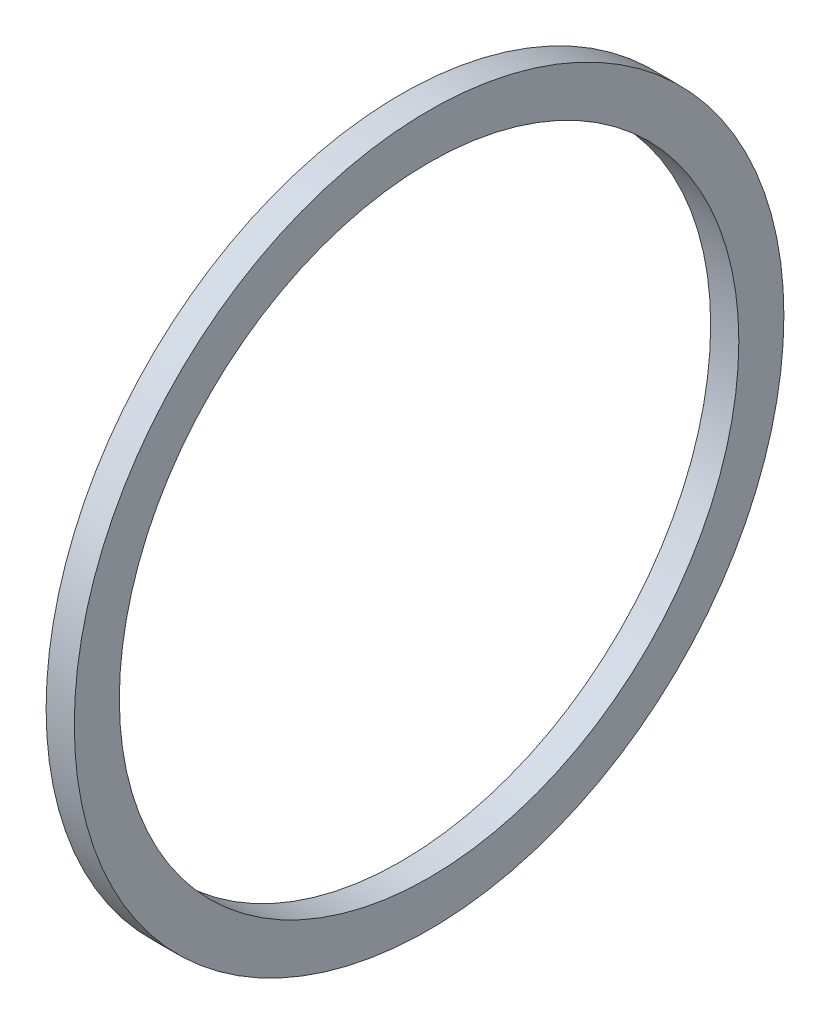
ISO-10303-21;
HEADER;
FILE_DESCRIPTION(('STEP AP214'),'2;1');
FILE_NAME('part.step','',(''),(''),'','','');
FILE_SCHEMA(('AUTOMOTIVE_DESIGN { 1 0 10303 214 1 1 1 1 }'));
ENDSEC;
DATA;
#1=APPLICATION_CONTEXT('core data for automotive mechanical design processes');
#2=APPLICATION_PROTOCOL_DEFINITION('international standard','automotive_design',2000,#1);
#3=PRODUCT_CONTEXT('',#1,'mechanical');
#4=PRODUCT('Part','Part','',(#3));
#5=PRODUCT_RELATED_PRODUCT_CATEGORY('part','',(#4));
#6=PRODUCT_DEFINITION_FORMATION('','',#4);
#7=PRODUCT_DEFINITION_CONTEXT('part definition',#1,'design');
#8=PRODUCT_DEFINITION('design','',#6,#7);
#9=PRODUCT_DEFINITION_SHAPE('','',#8);
#10=(LENGTH_UNIT() NAMED_UNIT(*) SI_UNIT(.MILLI.,.METRE.));
#11=(NAMED_UNIT(*) PLANE_ANGLE_UNIT() SI_UNIT($,.RADIAN.));
#12=(NAMED_UNIT(*) SI_UNIT($,.STERADIAN.) SOLID_ANGLE_UNIT());
#13=UNCERTAINTY_MEASURE_WITH_UNIT(LENGTH_MEASURE(1.E-05),#10,'distance_accuracy_value','');
#14=(GEOMETRIC_REPRESENTATION_CONTEXT(3) GLOBAL_UNCERTAINTY_ASSIGNED_CONTEXT((#13)) GLOBAL_UNIT_ASSIGNED_CONTEXT((#10,
#11,#12)) REPRESENTATION_CONTEXT('',''));
#15=CARTESIAN_POINT('',(0.,0.,0.));
#16=DIRECTION('',(0.,0.,1.));
#17=DIRECTION('',(1.,0.,0.));
#18=AXIS2_PLACEMENT_3D('',#15,#16,#17);
#19=CARTESIAN_POINT('',(1.5,0.,0.));
#20=DIRECTION('',(1.,0.,0.));
#21=DIRECTION('',(0.,0.,-1.));
#22=AXIS2_PLACEMENT_3D('',#19,#20,#21);
#23=PLANE('',#22);
#24=CARTESIAN_POINT('',(1.5,0.,0.));
#25=DIRECTION('',(1.,0.,0.));
#26=DIRECTION('',(0.,0.,-1.));
#27=AXIS2_PLACEMENT_3D('',#24,#25,#26);
#28=CIRCLE('',#27,18.9);
#29=CARTESIAN_POINT('',(1.5,0.,-18.9));
#30=VERTEX_POINT('',#29);
#31=EDGE_CURVE('E10',#30,#30,#28,.T.);
#32=ORIENTED_EDGE('',*,*,#31,.T.);
#33=EDGE_LOOP('',(#32));
#34=FACE_BOUND('',#33,.T.);
#35=CARTESIAN_POINT('',(1.5,0.,0.));
#36=DIRECTION('',(1.,0.,0.));
#37=DIRECTION('',(0.,0.,-1.));
#38=AXIS2_PLACEMENT_3D('',#35,#36,#37);
#39=CIRCLE('',#38,16.5);
#40=CARTESIAN_POINT('',(1.5,0.,-16.5));
#41=VERTEX_POINT('',#40);
#42=EDGE_CURVE('E42',#41,#41,#39,.T.);
#43=ORIENTED_EDGE('',*,*,#42,.F.);
#44=EDGE_LOOP('',(#43));
#45=FACE_BOUND('',#44,.T.);
#46=ADVANCED_FACE('F31',(#34,#45),#23,.T.);
#47=CARTESIAN_POINT('',(0.,0.,0.));
#48=DIRECTION('',(1.,0.,0.));
#49=DIRECTION('',(0.,0.,-1.));
#50=AXIS2_PLACEMENT_3D('',#47,#48,#49);
#51=PLANE('',#50);
#52=CARTESIAN_POINT('',(0.,0.,0.));
#53=DIRECTION('',(1.,0.,0.));
#54=DIRECTION('',(0.,0.,-1.));
#55=AXIS2_PLACEMENT_3D('',#52,#53,#54);
#56=CIRCLE('',#55,18.9);
#57=CARTESIAN_POINT('',(0.,0.,-18.9));
#58=VERTEX_POINT('',#57);
#59=EDGE_CURVE('E35',#58,#58,#56,.T.);
#60=ORIENTED_EDGE('',*,*,#59,.F.);
#61=EDGE_LOOP('',(#60));
#62=FACE_BOUND('',#61,.T.);
#63=CARTESIAN_POINT('',(0.,0.,0.));
#64=DIRECTION('',(1.,0.,0.));
#65=DIRECTION('',(0.,0.,-1.));
#66=AXIS2_PLACEMENT_3D('',#63,#64,#65);
#67=CIRCLE('',#66,16.5);
#68=CARTESIAN_POINT('',(0.,0.,-16.5));
#69=VERTEX_POINT('',#68);
#70=EDGE_CURVE('E44',#69,#69,#67,.T.);
#71=ORIENTED_EDGE('',*,*,#70,.T.);
#72=EDGE_LOOP('',(#71));
#73=FACE_BOUND('',#72,.T.);
#74=ADVANCED_FACE('F54',(#62,#73),#51,.F.);
#75=CARTESIAN_POINT('',(1.5,0.,0.));
#76=DIRECTION('',(-1.,0.,0.));
#77=DIRECTION('',(0.,0.,1.));
#78=AXIS2_PLACEMENT_3D('',#75,#76,#77);
#79=CYLINDRICAL_SURFACE('',#78,18.9);
#80=ORIENTED_EDGE('',*,*,#31,.F.);
#81=EDGE_LOOP('',(#80));
#82=FACE_BOUND('',#81,.T.);
#83=ORIENTED_EDGE('',*,*,#59,.T.);
#84=EDGE_LOOP('',(#83));
#85=FACE_BOUND('',#84,.T.);
#86=ADVANCED_FACE('F33',(#82,#85),#79,.T.);
#87=CARTESIAN_POINT('',(1.5,0.,0.));
#88=DIRECTION('',(-1.,0.,0.));
#89=DIRECTION('',(0.,0.,1.));
#90=AXIS2_PLACEMENT_3D('',#87,#88,#89);
#91=CYLINDRICAL_SURFACE('',#90,16.5);
#92=ORIENTED_EDGE('',*,*,#42,.T.);
#93=EDGE_LOOP('',(#92));
#94=FACE_BOUND('',#93,.T.);
#95=ORIENTED_EDGE('',*,*,#70,.F.);
#96=EDGE_LOOP('',(#95));
#97=FACE_BOUND('',#96,.T.);
#98=ADVANCED_FACE('F50',(#94,#97),#91,.F.);
#99=CLOSED_SHELL('',(#46,#74,#86,#98));
#100=MANIFOLD_SOLID_BREP('B2',#99);
#101=ADVANCED_BREP_SHAPE_REPRESENTATION('',(#18,#100),#14);
#102=SHAPE_DEFINITION_REPRESENTATION(#9,#101);
ENDSEC;
END-ISO-10303-21;
